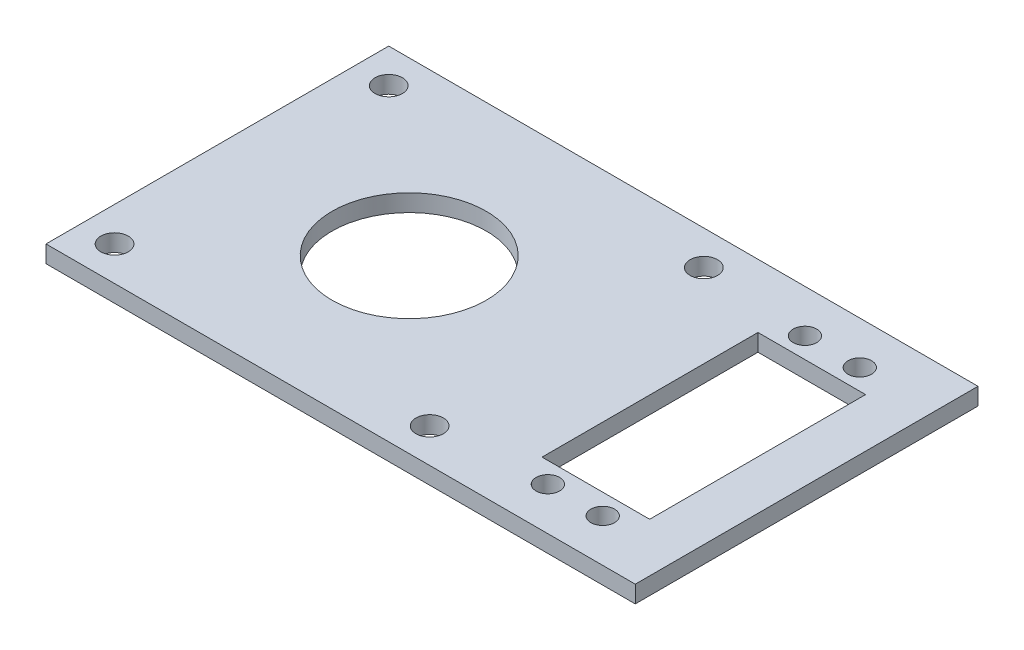
ISO-10303-21;
HEADER;
FILE_DESCRIPTION(('STEP AP214'),'2;1');
FILE_NAME('part.step','',(''),(''),'','','');
FILE_SCHEMA(('AUTOMOTIVE_DESIGN { 1 0 10303 214 1 1 1 1 }'));
ENDSEC;
DATA;
#1=APPLICATION_CONTEXT('core data for automotive mechanical design processes');
#2=APPLICATION_PROTOCOL_DEFINITION('international standard','automotive_design',2000,#1);
#3=PRODUCT_CONTEXT('',#1,'mechanical');
#4=PRODUCT('Part','Part','',(#3));
#5=PRODUCT_RELATED_PRODUCT_CATEGORY('part','',(#4));
#6=PRODUCT_DEFINITION_FORMATION('','',#4);
#7=PRODUCT_DEFINITION_CONTEXT('part definition',#1,'design');
#8=PRODUCT_DEFINITION('design','',#6,#7);
#9=PRODUCT_DEFINITION_SHAPE('','',#8);
#10=(LENGTH_UNIT() NAMED_UNIT(*) SI_UNIT(.MILLI.,.METRE.));
#11=(NAMED_UNIT(*) PLANE_ANGLE_UNIT() SI_UNIT($,.RADIAN.));
#12=(NAMED_UNIT(*) SI_UNIT($,.STERADIAN.) SOLID_ANGLE_UNIT());
#13=UNCERTAINTY_MEASURE_WITH_UNIT(LENGTH_MEASURE(1.E-05),#10,'distance_accuracy_value','');
#14=(GEOMETRIC_REPRESENTATION_CONTEXT(3) GLOBAL_UNCERTAINTY_ASSIGNED_CONTEXT((#13)) GLOBAL_UNIT_ASSIGNED_CONTEXT((#10,
#11,#12)) REPRESENTATION_CONTEXT('',''));
#15=CARTESIAN_POINT('',(0.,0.,0.));
#16=DIRECTION('',(0.,0.,1.));
#17=DIRECTION('',(1.,0.,0.));
#18=AXIS2_PLACEMENT_3D('',#15,#16,#17);
#19=CARTESIAN_POINT('',(0.,3.175,0.));
#20=DIRECTION('',(0.,-1.,0.));
#21=DIRECTION('',(0.,0.,-1.));
#22=AXIS2_PLACEMENT_3D('',#19,#20,#21);
#23=PLANE('',#22);
#24=DIRECTION('',(0.,0.,-1.));
#25=VECTOR('',#24,1.);
#26=CARTESIAN_POINT('',(19.05,3.175,-21.3995));
#27=LINE('',#26,#25);
#28=CARTESIAN_POINT('',(19.05,3.175,42.1005));
#29=VERTEX_POINT('',#28);
#30=CARTESIAN_POINT('',(19.05,3.175,-21.3995));
#31=VERTEX_POINT('',#30);
#32=EDGE_CURVE('E181',#29,#31,#27,.T.);
#33=ORIENTED_EDGE('',*,*,#32,.T.);
#34=DIRECTION('',(-1.,0.,0.));
#35=VECTOR('',#34,1.);
#36=CARTESIAN_POINT('',(19.05,3.175,-21.3995));
#37=LINE('',#36,#35);
#38=CARTESIAN_POINT('',(-90.129825169305,3.175,-21.3995));
#39=VERTEX_POINT('',#38);
#40=EDGE_CURVE('E184',#31,#39,#37,.T.);
#41=ORIENTED_EDGE('',*,*,#40,.T.);
#42=DIRECTION('',(0.,0.,1.));
#43=VECTOR('',#42,1.);
#44=CARTESIAN_POINT('',(-90.129825169305,3.175,42.1005));
#45=LINE('',#44,#43);
#46=CARTESIAN_POINT('',(-90.129825169305,3.175,42.1005));
#47=VERTEX_POINT('',#46);
#48=EDGE_CURVE('E118',#39,#47,#45,.T.);
#49=ORIENTED_EDGE('',*,*,#48,.T.);
#50=DIRECTION('',(1.,0.,0.));
#51=VECTOR('',#50,1.);
#52=CARTESIAN_POINT('',(19.05,3.175,42.1005));
#53=LINE('',#52,#51);
#54=EDGE_CURVE('E186',#47,#29,#53,.T.);
#55=ORIENTED_EDGE('',*,*,#54,.T.);
#56=EDGE_LOOP('',(#33,#41,#49,#55));
#57=FACE_BOUND('',#56,.T.);
#58=DIRECTION('',(0.,0.,-1.));
#59=VECTOR('',#58,1.);
#60=CARTESIAN_POINT('',(9.96950000000001,3.175,30.353));
#61=LINE('',#60,#59);
#62=CARTESIAN_POINT('',(9.96950000000001,3.175,30.353));
#63=VERTEX_POINT('',#62);
#64=CARTESIAN_POINT('',(9.96950000000001,3.175,-9.652));
#65=VERTEX_POINT('',#64);
#66=EDGE_CURVE('E156',#63,#65,#61,.T.);
#67=ORIENTED_EDGE('',*,*,#66,.F.);
#68=DIRECTION('',(1.,0.,0.));
#69=VECTOR('',#68,1.);
#70=CARTESIAN_POINT('',(-9.96949999999999,3.175,30.353));
#71=LINE('',#70,#69);
#72=CARTESIAN_POINT('',(-9.96949999999999,3.175,30.353));
#73=VERTEX_POINT('',#72);
#74=EDGE_CURVE('E163',#73,#63,#71,.T.);
#75=ORIENTED_EDGE('',*,*,#74,.F.);
#76=DIRECTION('',(0.,0.,1.));
#77=VECTOR('',#76,1.);
#78=CARTESIAN_POINT('',(-9.96949999999999,3.175,30.353));
#79=LINE('',#78,#77);
#80=CARTESIAN_POINT('',(-9.96949999999999,3.175,-9.652));
#81=VERTEX_POINT('',#80);
#82=EDGE_CURVE('E161',#81,#73,#79,.T.);
#83=ORIENTED_EDGE('',*,*,#82,.F.);
#84=DIRECTION('',(-1.,0.,0.));
#85=VECTOR('',#84,1.);
#86=CARTESIAN_POINT('',(-9.96949999999999,3.175,-9.652));
#87=LINE('',#86,#85);
#88=EDGE_CURVE('E158',#65,#81,#87,.T.);
#89=ORIENTED_EDGE('',*,*,#88,.F.);
#90=EDGE_LOOP('',(#67,#75,#83,#89));
#91=FACE_BOUND('',#90,.T.);
#92=CARTESIAN_POINT('',(5.08000000000001,3.175,-13.462));
#93=DIRECTION('',(0.,1.,0.));
#94=DIRECTION('',(0.,0.,1.));
#95=AXIS2_PLACEMENT_3D('',#92,#93,#94);
#96=CIRCLE('',#95,2.1844);
#97=CARTESIAN_POINT('',(5.08000000000001,3.175,-11.2776));
#98=VERTEX_POINT('',#97);
#99=EDGE_CURVE('E151',#98,#98,#96,.T.);
#100=ORIENTED_EDGE('',*,*,#99,.F.);
#101=EDGE_LOOP('',(#100));
#102=FACE_BOUND('',#101,.T.);
#103=CARTESIAN_POINT('',(-5.07999999999999,3.175,-13.462));
#104=DIRECTION('',(0.,1.,0.));
#105=DIRECTION('',(0.,0.,1.));
#106=AXIS2_PLACEMENT_3D('',#103,#104,#105);
#107=CIRCLE('',#106,2.1844);
#108=CARTESIAN_POINT('',(-5.07999999999999,3.175,-11.2776));
#109=VERTEX_POINT('',#108);
#110=EDGE_CURVE('E145',#109,#109,#107,.T.);
#111=ORIENTED_EDGE('',*,*,#110,.F.);
#112=EDGE_LOOP('',(#111));
#113=FACE_BOUND('',#112,.T.);
#114=CARTESIAN_POINT('',(-5.07999999999999,3.175,34.163));
#115=DIRECTION('',(0.,1.,0.));
#116=DIRECTION('',(0.,0.,1.));
#117=AXIS2_PLACEMENT_3D('',#114,#115,#116);
#118=CIRCLE('',#117,2.1844);
#119=CARTESIAN_POINT('',(-5.07999999999999,3.175,36.3474));
#120=VERTEX_POINT('',#119);
#121=EDGE_CURVE('E139',#120,#120,#118,.T.);
#122=ORIENTED_EDGE('',*,*,#121,.F.);
#123=EDGE_LOOP('',(#122));
#124=FACE_BOUND('',#123,.T.);
#125=CARTESIAN_POINT('',(5.08000000000001,3.175,34.163));
#126=DIRECTION('',(0.,1.,0.));
#127=DIRECTION('',(0.,0.,1.));
#128=AXIS2_PLACEMENT_3D('',#125,#126,#127);
#129=CIRCLE('',#128,2.1844);
#130=CARTESIAN_POINT('',(5.08000000000001,3.175,36.3474));
#131=VERTEX_POINT('',#130);
#132=EDGE_CURVE('E133',#131,#131,#129,.T.);
#133=ORIENTED_EDGE('',*,*,#132,.F.);
#134=EDGE_LOOP('',(#133));
#135=FACE_BOUND('',#134,.T.);
#136=CARTESIAN_POINT('',(-83.779825169305,3.175,35.7505));
#137=DIRECTION('',(0.,1.,0.));
#138=DIRECTION('',(0.,0.,1.));
#139=AXIS2_PLACEMENT_3D('',#136,#137,#138);
#140=CIRCLE('',#139,2.54);
#141=CARTESIAN_POINT('',(-83.779825169305,3.175,38.2905));
#142=VERTEX_POINT('',#141);
#143=EDGE_CURVE('E214',#142,#142,#140,.T.);
#144=ORIENTED_EDGE('',*,*,#143,.F.);
#145=EDGE_LOOP('',(#144));
#146=FACE_BOUND('',#145,.T.);
#147=CARTESIAN_POINT('',(-25.4,3.175,35.7505));
#148=DIRECTION('',(0.,1.,0.));
#149=DIRECTION('',(0.,0.,1.));
#150=AXIS2_PLACEMENT_3D('',#147,#148,#149);
#151=CIRCLE('',#150,2.54);
#152=CARTESIAN_POINT('',(-25.4,3.175,38.2905));
#153=VERTEX_POINT('',#152);
#154=EDGE_CURVE('E218',#153,#153,#151,.T.);
#155=ORIENTED_EDGE('',*,*,#154,.F.);
#156=EDGE_LOOP('',(#155));
#157=FACE_BOUND('',#156,.T.);
#158=CARTESIAN_POINT('',(-25.4,3.175,-15.0495));
#159=DIRECTION('',(0.,1.,0.));
#160=DIRECTION('',(0.,0.,1.));
#161=AXIS2_PLACEMENT_3D('',#158,#159,#160);
#162=CIRCLE('',#161,2.54);
#163=CARTESIAN_POINT('',(-25.4,3.175,-12.5095));
#164=VERTEX_POINT('',#163);
#165=EDGE_CURVE('E222',#164,#164,#162,.T.);
#166=ORIENTED_EDGE('',*,*,#165,.F.);
#167=EDGE_LOOP('',(#166));
#168=FACE_BOUND('',#167,.T.);
#169=CARTESIAN_POINT('',(-83.779825169305,3.175,-15.0495));
#170=DIRECTION('',(0.,1.,0.));
#171=DIRECTION('',(0.,0.,1.));
#172=AXIS2_PLACEMENT_3D('',#169,#170,#171);
#173=CIRCLE('',#172,2.54);
#174=CARTESIAN_POINT('',(-83.779825169305,3.175,-12.5095));
#175=VERTEX_POINT('',#174);
#176=EDGE_CURVE('E226',#175,#175,#173,.T.);
#177=ORIENTED_EDGE('',*,*,#176,.F.);
#178=EDGE_LOOP('',(#177));
#179=FACE_BOUND('',#178,.T.);
#180=CARTESIAN_POINT('',(-54.5899125846525,3.175,10.3505));
#181=DIRECTION('',(0.,1.,0.));
#182=DIRECTION('',(0.,0.,1.));
#183=AXIS2_PLACEMENT_3D('',#180,#181,#182);
#184=CIRCLE('',#183,14.2875);
#185=CARTESIAN_POINT('',(-54.5899125846525,3.175,24.638));
#186=VERTEX_POINT('',#185);
#187=EDGE_CURVE('E128',#186,#186,#184,.T.);
#188=ORIENTED_EDGE('',*,*,#187,.F.);
#189=EDGE_LOOP('',(#188));
#190=FACE_BOUND('',#189,.T.);
#191=ADVANCED_FACE('F33',(#57,#91,#102,#113,#124,#135,#146,#157,#168,#179,#190),#23,.F.);
#192=CARTESIAN_POINT('',(0.,0.,0.));
#193=DIRECTION('',(0.,-1.,0.));
#194=DIRECTION('',(0.,0.,-1.));
#195=AXIS2_PLACEMENT_3D('',#192,#193,#194);
#196=PLANE('',#195);
#197=CARTESIAN_POINT('',(-5.07999999999999,0.,34.163));
#198=DIRECTION('',(0.,1.,0.));
#199=DIRECTION('',(0.,0.,1.));
#200=AXIS2_PLACEMENT_3D('',#197,#198,#199);
#201=CIRCLE('',#200,2.1844);
#202=CARTESIAN_POINT('',(-5.07999999999999,0.,36.3474));
#203=VERTEX_POINT('',#202);
#204=EDGE_CURVE('E136',#203,#203,#201,.T.);
#205=ORIENTED_EDGE('',*,*,#204,.T.);
#206=EDGE_LOOP('',(#205));
#207=FACE_BOUND('',#206,.T.);
#208=CARTESIAN_POINT('',(5.08000000000001,0.,-13.462));
#209=DIRECTION('',(0.,1.,0.));
#210=DIRECTION('',(0.,0.,1.));
#211=AXIS2_PLACEMENT_3D('',#208,#209,#210);
#212=CIRCLE('',#211,2.1844);
#213=CARTESIAN_POINT('',(5.08000000000001,0.,-11.2776));
#214=VERTEX_POINT('',#213);
#215=EDGE_CURVE('E148',#214,#214,#212,.T.);
#216=ORIENTED_EDGE('',*,*,#215,.T.);
#217=EDGE_LOOP('',(#216));
#218=FACE_BOUND('',#217,.T.);
#219=DIRECTION('',(0.,0.,-1.));
#220=VECTOR('',#219,1.);
#221=CARTESIAN_POINT('',(19.05,0.,-21.3995));
#222=LINE('',#221,#220);
#223=CARTESIAN_POINT('',(19.05,0.,42.1005));
#224=VERTEX_POINT('',#223);
#225=CARTESIAN_POINT('',(19.05,0.,-21.3995));
#226=VERTEX_POINT('',#225);
#227=EDGE_CURVE('E110',#224,#226,#222,.T.);
#228=ORIENTED_EDGE('',*,*,#227,.F.);
#229=DIRECTION('',(1.,0.,0.));
#230=VECTOR('',#229,1.);
#231=CARTESIAN_POINT('',(19.05,0.,42.1005));
#232=LINE('',#231,#230);
#233=CARTESIAN_POINT('',(-90.129825169305,0.,42.1005));
#234=VERTEX_POINT('',#233);
#235=EDGE_CURVE('E109',#234,#224,#232,.T.);
#236=ORIENTED_EDGE('',*,*,#235,.F.);
#237=DIRECTION('',(0.,0.,1.));
#238=VECTOR('',#237,1.);
#239=CARTESIAN_POINT('',(-90.129825169305,0.,42.1005));
#240=LINE('',#239,#238);
#241=CARTESIAN_POINT('',(-90.129825169305,0.,-21.3995));
#242=VERTEX_POINT('',#241);
#243=EDGE_CURVE('E116',#242,#234,#240,.T.);
#244=ORIENTED_EDGE('',*,*,#243,.F.);
#245=DIRECTION('',(-1.,0.,0.));
#246=VECTOR('',#245,1.);
#247=CARTESIAN_POINT('',(19.05,0.,-21.3995));
#248=LINE('',#247,#246);
#249=EDGE_CURVE('E99',#226,#242,#248,.T.);
#250=ORIENTED_EDGE('',*,*,#249,.F.);
#251=EDGE_LOOP('',(#228,#236,#244,#250));
#252=FACE_BOUND('',#251,.T.);
#253=DIRECTION('',(1.,0.,0.));
#254=VECTOR('',#253,1.);
#255=CARTESIAN_POINT('',(-9.96949999999999,0.,30.353));
#256=LINE('',#255,#254);
#257=CARTESIAN_POINT('',(-9.96949999999999,0.,30.353));
#258=VERTEX_POINT('',#257);
#259=CARTESIAN_POINT('',(9.96950000000001,0.,30.353));
#260=VERTEX_POINT('',#259);
#261=EDGE_CURVE('E159',#258,#260,#256,.T.);
#262=ORIENTED_EDGE('',*,*,#261,.T.);
#263=DIRECTION('',(0.,0.,-1.));
#264=VECTOR('',#263,1.);
#265=CARTESIAN_POINT('',(9.96950000000001,0.,30.353));
#266=LINE('',#265,#264);
#267=CARTESIAN_POINT('',(9.96950000000001,0.,-9.652));
#268=VERTEX_POINT('',#267);
#269=EDGE_CURVE('E56',#260,#268,#266,.T.);
#270=ORIENTED_EDGE('',*,*,#269,.T.);
#271=DIRECTION('',(-1.,0.,0.));
#272=VECTOR('',#271,1.);
#273=CARTESIAN_POINT('',(-9.96949999999999,0.,-9.652));
#274=LINE('',#273,#272);
#275=CARTESIAN_POINT('',(-9.96949999999999,0.,-9.652));
#276=VERTEX_POINT('',#275);
#277=EDGE_CURVE('E167',#268,#276,#274,.T.);
#278=ORIENTED_EDGE('',*,*,#277,.T.);
#279=DIRECTION('',(0.,0.,1.));
#280=VECTOR('',#279,1.);
#281=CARTESIAN_POINT('',(-9.96949999999999,0.,30.353));
#282=LINE('',#281,#280);
#283=EDGE_CURVE('E170',#276,#258,#282,.T.);
#284=ORIENTED_EDGE('',*,*,#283,.T.);
#285=EDGE_LOOP('',(#262,#270,#278,#284));
#286=FACE_BOUND('',#285,.T.);
#287=CARTESIAN_POINT('',(-5.07999999999999,0.,-13.462));
#288=DIRECTION('',(0.,1.,0.));
#289=DIRECTION('',(0.,0.,1.));
#290=AXIS2_PLACEMENT_3D('',#287,#288,#289);
#291=CIRCLE('',#290,2.1844);
#292=CARTESIAN_POINT('',(-5.07999999999999,0.,-11.2776));
#293=VERTEX_POINT('',#292);
#294=EDGE_CURVE('E142',#293,#293,#291,.T.);
#295=ORIENTED_EDGE('',*,*,#294,.T.);
#296=EDGE_LOOP('',(#295));
#297=FACE_BOUND('',#296,.T.);
#298=CARTESIAN_POINT('',(5.08000000000001,0.,34.163));
#299=DIRECTION('',(0.,1.,0.));
#300=DIRECTION('',(0.,0.,1.));
#301=AXIS2_PLACEMENT_3D('',#298,#299,#300);
#302=CIRCLE('',#301,2.1844);
#303=CARTESIAN_POINT('',(5.08000000000001,0.,36.3474));
#304=VERTEX_POINT('',#303);
#305=EDGE_CURVE('E131',#304,#304,#302,.T.);
#306=ORIENTED_EDGE('',*,*,#305,.T.);
#307=EDGE_LOOP('',(#306));
#308=FACE_BOUND('',#307,.T.);
#309=CARTESIAN_POINT('',(-83.779825169305,0.,35.7505));
#310=DIRECTION('',(0.,1.,0.));
#311=DIRECTION('',(0.,0.,1.));
#312=AXIS2_PLACEMENT_3D('',#309,#310,#311);
#313=CIRCLE('',#312,2.54);
#314=CARTESIAN_POINT('',(-83.779825169305,0.,38.2905));
#315=VERTEX_POINT('',#314);
#316=EDGE_CURVE('E244',#315,#315,#313,.T.);
#317=ORIENTED_EDGE('',*,*,#316,.T.);
#318=EDGE_LOOP('',(#317));
#319=FACE_BOUND('',#318,.T.);
#320=CARTESIAN_POINT('',(-25.4,0.,35.7505));
#321=DIRECTION('',(0.,1.,0.));
#322=DIRECTION('',(0.,0.,1.));
#323=AXIS2_PLACEMENT_3D('',#320,#321,#322);
#324=CIRCLE('',#323,2.54);
#325=CARTESIAN_POINT('',(-25.4,0.,38.2905));
#326=VERTEX_POINT('',#325);
#327=EDGE_CURVE('E240',#326,#326,#324,.T.);
#328=ORIENTED_EDGE('',*,*,#327,.T.);
#329=EDGE_LOOP('',(#328));
#330=FACE_BOUND('',#329,.T.);
#331=CARTESIAN_POINT('',(-25.4,0.,-15.0495));
#332=DIRECTION('',(0.,1.,0.));
#333=DIRECTION('',(0.,0.,1.));
#334=AXIS2_PLACEMENT_3D('',#331,#332,#333);
#335=CIRCLE('',#334,2.54);
#336=CARTESIAN_POINT('',(-25.4,0.,-12.5095));
#337=VERTEX_POINT('',#336);
#338=EDGE_CURVE('E236',#337,#337,#335,.T.);
#339=ORIENTED_EDGE('',*,*,#338,.T.);
#340=EDGE_LOOP('',(#339));
#341=FACE_BOUND('',#340,.T.);
#342=CARTESIAN_POINT('',(-83.779825169305,0.,-15.0495));
#343=DIRECTION('',(0.,1.,0.));
#344=DIRECTION('',(0.,0.,1.));
#345=AXIS2_PLACEMENT_3D('',#342,#343,#344);
#346=CIRCLE('',#345,2.54);
#347=CARTESIAN_POINT('',(-83.779825169305,0.,-12.5095));
#348=VERTEX_POINT('',#347);
#349=EDGE_CURVE('E230',#348,#348,#346,.T.);
#350=ORIENTED_EDGE('',*,*,#349,.T.);
#351=EDGE_LOOP('',(#350));
#352=FACE_BOUND('',#351,.T.);
#353=CARTESIAN_POINT('',(-54.5899125846525,0.,10.3505));
#354=DIRECTION('',(0.,1.,0.));
#355=DIRECTION('',(0.,0.,1.));
#356=AXIS2_PLACEMENT_3D('',#353,#354,#355);
#357=CIRCLE('',#356,14.2875);
#358=CARTESIAN_POINT('',(-54.5899125846525,0.,24.638));
#359=VERTEX_POINT('',#358);
#360=EDGE_CURVE('E125',#359,#359,#357,.T.);
#361=ORIENTED_EDGE('',*,*,#360,.T.);
#362=EDGE_LOOP('',(#361));
#363=FACE_BOUND('',#362,.T.);
#364=ADVANCED_FACE('F121',(#207,#218,#252,#286,#297,#308,#319,#330,#341,#352,#363),#196,.T.);
#365=CARTESIAN_POINT('',(19.05,3.175,-21.3995));
#366=DIRECTION('',(-1.,0.,0.));
#367=DIRECTION('',(0.,0.,1.));
#368=AXIS2_PLACEMENT_3D('',#365,#366,#367);
#369=PLANE('',#368);
#370=ORIENTED_EDGE('',*,*,#227,.T.);
#371=DIRECTION('',(0.,-1.,0.));
#372=VECTOR('',#371,1.);
#373=CARTESIAN_POINT('',(19.05,3.175,-21.3995));
#374=LINE('',#373,#372);
#375=EDGE_CURVE('E11',#31,#226,#374,.T.);
#376=ORIENTED_EDGE('',*,*,#375,.F.);
#377=ORIENTED_EDGE('',*,*,#32,.F.);
#378=DIRECTION('',(0.,-1.,0.));
#379=VECTOR('',#378,1.);
#380=CARTESIAN_POINT('',(19.05,3.175,42.1005));
#381=LINE('',#380,#379);
#382=EDGE_CURVE('E41',#29,#224,#381,.T.);
#383=ORIENTED_EDGE('',*,*,#382,.T.);
#384=EDGE_LOOP('',(#370,#376,#377,#383));
#385=FACE_BOUND('',#384,.T.);
#386=ADVANCED_FACE('F35',(#385),#369,.F.);
#387=CARTESIAN_POINT('',(19.05,3.175,-21.3995));
#388=DIRECTION('',(0.,0.,1.));
#389=DIRECTION('',(1.,0.,0.));
#390=AXIS2_PLACEMENT_3D('',#387,#388,#389);
#391=PLANE('',#390);
#392=ORIENTED_EDGE('',*,*,#249,.T.);
#393=DIRECTION('',(0.,1.,0.));
#394=VECTOR('',#393,1.);
#395=CARTESIAN_POINT('',(-90.129825169305,0.,-21.3995));
#396=LINE('',#395,#394);
#397=EDGE_CURVE('E102',#242,#39,#396,.T.);
#398=ORIENTED_EDGE('',*,*,#397,.T.);
#399=ORIENTED_EDGE('',*,*,#40,.F.);
#400=ORIENTED_EDGE('',*,*,#375,.T.);
#401=EDGE_LOOP('',(#392,#398,#399,#400));
#402=FACE_BOUND('',#401,.T.);
#403=ADVANCED_FACE('F101',(#402),#391,.F.);
#404=CARTESIAN_POINT('',(19.05,3.175,42.1005));
#405=DIRECTION('',(0.,0.,-1.));
#406=DIRECTION('',(-1.,0.,0.));
#407=AXIS2_PLACEMENT_3D('',#404,#405,#406);
#408=PLANE('',#407);
#409=ORIENTED_EDGE('',*,*,#235,.T.);
#410=ORIENTED_EDGE('',*,*,#382,.F.);
#411=ORIENTED_EDGE('',*,*,#54,.F.);
#412=DIRECTION('',(0.,1.,0.));
#413=VECTOR('',#412,1.);
#414=CARTESIAN_POINT('',(-90.129825169305,0.,42.1005));
#415=LINE('',#414,#413);
#416=EDGE_CURVE('E119',#234,#47,#415,.T.);
#417=ORIENTED_EDGE('',*,*,#416,.F.);
#418=EDGE_LOOP('',(#409,#410,#411,#417));
#419=FACE_BOUND('',#418,.T.);
#420=ADVANCED_FACE('F194',(#419),#408,.F.);
#421=CARTESIAN_POINT('',(9.96950000000001,3.175,30.353));
#422=DIRECTION('',(-1.,0.,0.));
#423=DIRECTION('',(0.,0.,1.));
#424=AXIS2_PLACEMENT_3D('',#421,#422,#423);
#425=PLANE('',#424);
#426=ORIENTED_EDGE('',*,*,#269,.F.);
#427=DIRECTION('',(0.,-1.,0.));
#428=VECTOR('',#427,1.);
#429=CARTESIAN_POINT('',(9.96950000000001,3.175,30.353));
#430=LINE('',#429,#428);
#431=EDGE_CURVE('E165',#63,#260,#430,.T.);
#432=ORIENTED_EDGE('',*,*,#431,.F.);
#433=ORIENTED_EDGE('',*,*,#66,.T.);
#434=DIRECTION('',(0.,-1.,0.));
#435=VECTOR('',#434,1.);
#436=CARTESIAN_POINT('',(9.96950000000001,3.175,-9.652));
#437=LINE('',#436,#435);
#438=EDGE_CURVE('E179',#65,#268,#437,.T.);
#439=ORIENTED_EDGE('',*,*,#438,.T.);
#440=EDGE_LOOP('',(#426,#432,#433,#439));
#441=FACE_BOUND('',#440,.T.);
#442=ADVANCED_FACE('F304',(#441),#425,.T.);
#443=CARTESIAN_POINT('',(-9.96949999999999,3.175,-9.652));
#444=DIRECTION('',(0.,0.,1.));
#445=DIRECTION('',(1.,0.,0.));
#446=AXIS2_PLACEMENT_3D('',#443,#444,#445);
#447=PLANE('',#446);
#448=ORIENTED_EDGE('',*,*,#277,.F.);
#449=ORIENTED_EDGE('',*,*,#438,.F.);
#450=ORIENTED_EDGE('',*,*,#88,.T.);
#451=DIRECTION('',(0.,-1.,0.));
#452=VECTOR('',#451,1.);
#453=CARTESIAN_POINT('',(-9.96949999999999,3.175,-9.652));
#454=LINE('',#453,#452);
#455=EDGE_CURVE('E177',#81,#276,#454,.T.);
#456=ORIENTED_EDGE('',*,*,#455,.T.);
#457=EDGE_LOOP('',(#448,#449,#450,#456));
#458=FACE_BOUND('',#457,.T.);
#459=ADVANCED_FACE('F300',(#458),#447,.T.);
#460=CARTESIAN_POINT('',(-9.96949999999999,3.175,30.353));
#461=DIRECTION('',(1.,0.,0.));
#462=DIRECTION('',(0.,0.,-1.));
#463=AXIS2_PLACEMENT_3D('',#460,#461,#462);
#464=PLANE('',#463);
#465=ORIENTED_EDGE('',*,*,#283,.F.);
#466=ORIENTED_EDGE('',*,*,#455,.F.);
#467=ORIENTED_EDGE('',*,*,#82,.T.);
#468=DIRECTION('',(0.,-1.,0.));
#469=VECTOR('',#468,1.);
#470=CARTESIAN_POINT('',(-9.96949999999999,3.175,30.353));
#471=LINE('',#470,#469);
#472=EDGE_CURVE('E48',#73,#258,#471,.T.);
#473=ORIENTED_EDGE('',*,*,#472,.T.);
#474=EDGE_LOOP('',(#465,#466,#467,#473));
#475=FACE_BOUND('',#474,.T.);
#476=ADVANCED_FACE('F297',(#475),#464,.T.);
#477=CARTESIAN_POINT('',(-9.96949999999999,3.175,30.353));
#478=DIRECTION('',(0.,0.,-1.));
#479=DIRECTION('',(-1.,0.,0.));
#480=AXIS2_PLACEMENT_3D('',#477,#478,#479);
#481=PLANE('',#480);
#482=ORIENTED_EDGE('',*,*,#261,.F.);
#483=ORIENTED_EDGE('',*,*,#472,.F.);
#484=ORIENTED_EDGE('',*,*,#74,.T.);
#485=ORIENTED_EDGE('',*,*,#431,.T.);
#486=EDGE_LOOP('',(#482,#483,#484,#485));
#487=FACE_BOUND('',#486,.T.);
#488=ADVANCED_FACE('F293',(#487),#481,.T.);
#489=CARTESIAN_POINT('',(5.08000000000001,3.175,-13.462));
#490=DIRECTION('',(0.,-1.,0.));
#491=DIRECTION('',(0.,0.,-1.));
#492=AXIS2_PLACEMENT_3D('',#489,#490,#491);
#493=CYLINDRICAL_SURFACE('',#492,2.1844);
#494=ORIENTED_EDGE('',*,*,#99,.T.);
#495=EDGE_LOOP('',(#494));
#496=FACE_BOUND('',#495,.T.);
#497=ORIENTED_EDGE('',*,*,#215,.F.);
#498=EDGE_LOOP('',(#497));
#499=FACE_BOUND('',#498,.T.);
#500=ADVANCED_FACE('F289',(#496,#499),#493,.F.);
#501=CARTESIAN_POINT('',(-5.07999999999999,3.175,-13.462));
#502=DIRECTION('',(0.,-1.,0.));
#503=DIRECTION('',(0.,0.,-1.));
#504=AXIS2_PLACEMENT_3D('',#501,#502,#503);
#505=CYLINDRICAL_SURFACE('',#504,2.1844);
#506=ORIENTED_EDGE('',*,*,#110,.T.);
#507=EDGE_LOOP('',(#506));
#508=FACE_BOUND('',#507,.T.);
#509=ORIENTED_EDGE('',*,*,#294,.F.);
#510=EDGE_LOOP('',(#509));
#511=FACE_BOUND('',#510,.T.);
#512=ADVANCED_FACE('F285',(#508,#511),#505,.F.);
#513=CARTESIAN_POINT('',(-5.07999999999999,3.175,34.163));
#514=DIRECTION('',(0.,-1.,0.));
#515=DIRECTION('',(0.,0.,-1.));
#516=AXIS2_PLACEMENT_3D('',#513,#514,#515);
#517=CYLINDRICAL_SURFACE('',#516,2.1844);
#518=ORIENTED_EDGE('',*,*,#121,.T.);
#519=EDGE_LOOP('',(#518));
#520=FACE_BOUND('',#519,.T.);
#521=ORIENTED_EDGE('',*,*,#204,.F.);
#522=EDGE_LOOP('',(#521));
#523=FACE_BOUND('',#522,.T.);
#524=ADVANCED_FACE('F281',(#520,#523),#517,.F.);
#525=CARTESIAN_POINT('',(5.08000000000001,3.175,34.163));
#526=DIRECTION('',(0.,-1.,0.));
#527=DIRECTION('',(0.,0.,-1.));
#528=AXIS2_PLACEMENT_3D('',#525,#526,#527);
#529=CYLINDRICAL_SURFACE('',#528,2.1844);
#530=ORIENTED_EDGE('',*,*,#132,.T.);
#531=EDGE_LOOP('',(#530));
#532=FACE_BOUND('',#531,.T.);
#533=ORIENTED_EDGE('',*,*,#305,.F.);
#534=EDGE_LOOP('',(#533));
#535=FACE_BOUND('',#534,.T.);
#536=ADVANCED_FACE('F278',(#532,#535),#529,.F.);
#537=CARTESIAN_POINT('',(-90.129825169305,0.,42.1005));
#538=DIRECTION('',(-1.,0.,0.));
#539=DIRECTION('',(0.,0.,1.));
#540=AXIS2_PLACEMENT_3D('',#537,#538,#539);
#541=PLANE('',#540);
#542=ORIENTED_EDGE('',*,*,#48,.F.);
#543=ORIENTED_EDGE('',*,*,#397,.F.);
#544=ORIENTED_EDGE('',*,*,#243,.T.);
#545=ORIENTED_EDGE('',*,*,#416,.T.);
#546=EDGE_LOOP('',(#542,#543,#544,#545));
#547=FACE_BOUND('',#546,.T.);
#548=ADVANCED_FACE('F114',(#547),#541,.T.);
#549=CARTESIAN_POINT('',(-54.5899125846525,0.,10.3505));
#550=DIRECTION('',(0.,1.,0.));
#551=DIRECTION('',(0.,0.,1.));
#552=AXIS2_PLACEMENT_3D('',#549,#550,#551);
#553=CYLINDRICAL_SURFACE('',#552,14.2875);
#554=ORIENTED_EDGE('',*,*,#360,.F.);
#555=EDGE_LOOP('',(#554));
#556=FACE_BOUND('',#555,.T.);
#557=ORIENTED_EDGE('',*,*,#187,.T.);
#558=EDGE_LOOP('',(#557));
#559=FACE_BOUND('',#558,.T.);
#560=ADVANCED_FACE('F271',(#556,#559),#553,.F.);
#561=CARTESIAN_POINT('',(-83.779825169305,0.,-15.0495));
#562=DIRECTION('',(0.,1.,0.));
#563=DIRECTION('',(0.,0.,1.));
#564=AXIS2_PLACEMENT_3D('',#561,#562,#563);
#565=CYLINDRICAL_SURFACE('',#564,2.54);
#566=ORIENTED_EDGE('',*,*,#349,.F.);
#567=EDGE_LOOP('',(#566));
#568=FACE_BOUND('',#567,.T.);
#569=ORIENTED_EDGE('',*,*,#176,.T.);
#570=EDGE_LOOP('',(#569));
#571=FACE_BOUND('',#570,.T.);
#572=ADVANCED_FACE('F267',(#568,#571),#565,.F.);
#573=CARTESIAN_POINT('',(-25.4,0.,-15.0495));
#574=DIRECTION('',(0.,1.,0.));
#575=DIRECTION('',(0.,0.,1.));
#576=AXIS2_PLACEMENT_3D('',#573,#574,#575);
#577=CYLINDRICAL_SURFACE('',#576,2.54);
#578=ORIENTED_EDGE('',*,*,#338,.F.);
#579=EDGE_LOOP('',(#578));
#580=FACE_BOUND('',#579,.T.);
#581=ORIENTED_EDGE('',*,*,#165,.T.);
#582=EDGE_LOOP('',(#581));
#583=FACE_BOUND('',#582,.T.);
#584=ADVANCED_FACE('F261',(#580,#583),#577,.F.);
#585=CARTESIAN_POINT('',(-25.4,0.,35.7505));
#586=DIRECTION('',(0.,1.,0.));
#587=DIRECTION('',(0.,0.,1.));
#588=AXIS2_PLACEMENT_3D('',#585,#586,#587);
#589=CYLINDRICAL_SURFACE('',#588,2.54);
#590=ORIENTED_EDGE('',*,*,#327,.F.);
#591=EDGE_LOOP('',(#590));
#592=FACE_BOUND('',#591,.T.);
#593=ORIENTED_EDGE('',*,*,#154,.T.);
#594=EDGE_LOOP('',(#593));
#595=FACE_BOUND('',#594,.T.);
#596=ADVANCED_FACE('F256',(#592,#595),#589,.F.);
#597=CARTESIAN_POINT('',(-83.779825169305,0.,35.7505));
#598=DIRECTION('',(0.,1.,0.));
#599=DIRECTION('',(0.,0.,1.));
#600=AXIS2_PLACEMENT_3D('',#597,#598,#599);
#601=CYLINDRICAL_SURFACE('',#600,2.54);
#602=ORIENTED_EDGE('',*,*,#316,.F.);
#603=EDGE_LOOP('',(#602));
#604=FACE_BOUND('',#603,.T.);
#605=ORIENTED_EDGE('',*,*,#143,.T.);
#606=EDGE_LOOP('',(#605));
#607=FACE_BOUND('',#606,.T.);
#608=ADVANCED_FACE('F253',(#604,#607),#601,.F.);
#609=CLOSED_SHELL('',(#191,#364,#386,#403,#420,#442,#459,#476,#488,#500,#512,#524,#536,#548,
#560,#572,#584,#596,#608));
#610=MANIFOLD_SOLID_BREP('B2',#609);
#611=ADVANCED_BREP_SHAPE_REPRESENTATION('',(#18,#610),#14);
#612=SHAPE_DEFINITION_REPRESENTATION(#9,#611);
ENDSEC;
END-ISO-10303-21;
